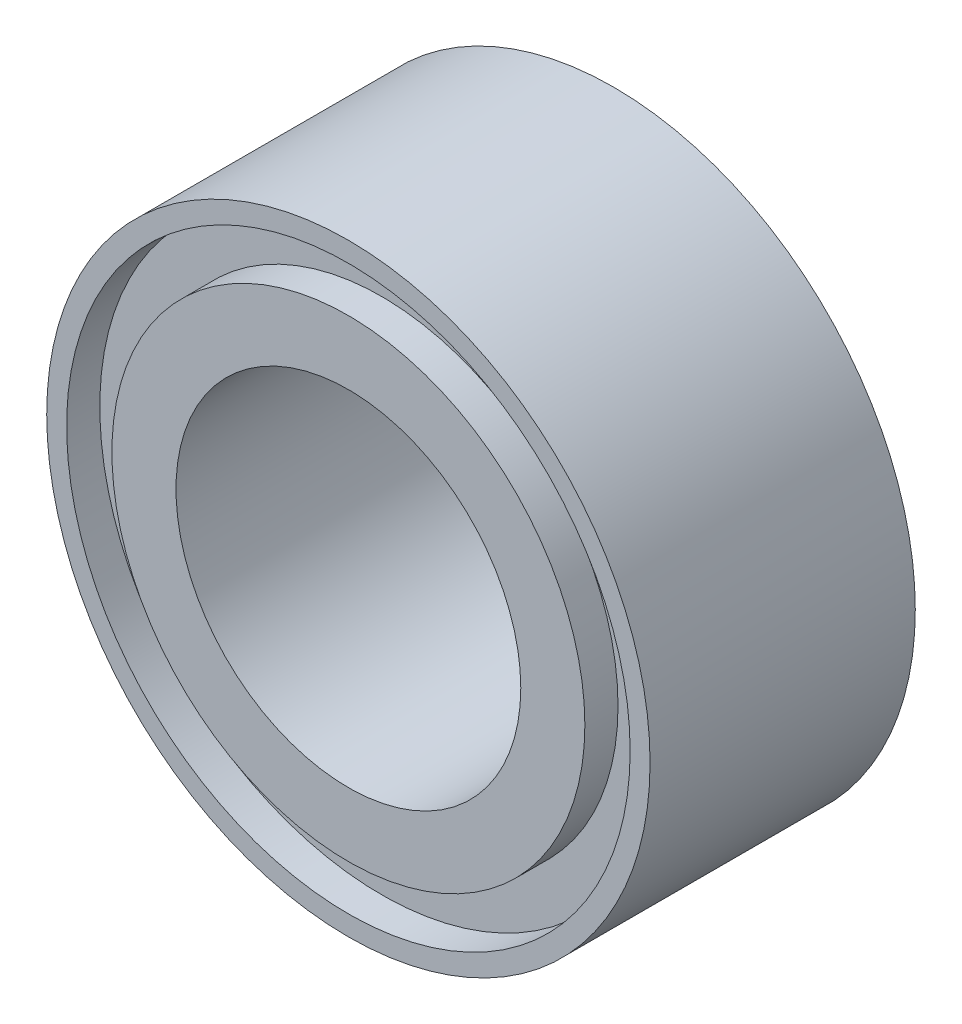
ISO-10303-21;
HEADER;
FILE_DESCRIPTION(('STEP AP214'),'2;1');
FILE_NAME('part.step','',(''),(''),'','','');
FILE_SCHEMA(('AUTOMOTIVE_DESIGN { 1 0 10303 214 1 1 1 1 }'));
ENDSEC;
DATA;
#1=APPLICATION_CONTEXT('core data for automotive mechanical design processes');
#2=APPLICATION_PROTOCOL_DEFINITION('international standard','automotive_design',2000,#1);
#3=PRODUCT_CONTEXT('',#1,'mechanical');
#4=PRODUCT('Part','Part','',(#3));
#5=PRODUCT_RELATED_PRODUCT_CATEGORY('part','',(#4));
#6=PRODUCT_DEFINITION_FORMATION('','',#4);
#7=PRODUCT_DEFINITION_CONTEXT('part definition',#1,'design');
#8=PRODUCT_DEFINITION('design','',#6,#7);
#9=PRODUCT_DEFINITION_SHAPE('','',#8);
#10=(LENGTH_UNIT() NAMED_UNIT(*) SI_UNIT(.MILLI.,.METRE.));
#11=(NAMED_UNIT(*) PLANE_ANGLE_UNIT() SI_UNIT($,.RADIAN.));
#12=(NAMED_UNIT(*) SI_UNIT($,.STERADIAN.) SOLID_ANGLE_UNIT());
#13=UNCERTAINTY_MEASURE_WITH_UNIT(LENGTH_MEASURE(1.E-05),#10,'distance_accuracy_value','');
#14=(GEOMETRIC_REPRESENTATION_CONTEXT(3) GLOBAL_UNCERTAINTY_ASSIGNED_CONTEXT((#13)) GLOBAL_UNIT_ASSIGNED_CONTEXT((#10,
#11,#12)) REPRESENTATION_CONTEXT('',''));
#15=CARTESIAN_POINT('',(0.,0.,0.));
#16=DIRECTION('',(0.,0.,1.));
#17=DIRECTION('',(1.,0.,0.));
#18=AXIS2_PLACEMENT_3D('',#15,#16,#17);
#19=CARTESIAN_POINT('',(0.,0.,-20.));
#20=DIRECTION('',(0.,0.,-1.));
#21=DIRECTION('',(1.,0.,0.));
#22=AXIS2_PLACEMENT_3D('',#19,#20,#21);
#23=PLANE('',#22);
#24=CARTESIAN_POINT('',(0.,0.,-20.));
#25=DIRECTION('',(0.,0.,1.));
#26=DIRECTION('',(1.,0.,0.));
#27=AXIS2_PLACEMENT_3D('',#24,#25,#26);
#28=CIRCLE('',#27,26.);
#29=CARTESIAN_POINT('',(26.,0.,-20.));
#30=VERTEX_POINT('',#29);
#31=EDGE_CURVE('E79',#30,#30,#28,.T.);
#32=ORIENTED_EDGE('',*,*,#31,.T.);
#33=EDGE_LOOP('',(#32));
#34=FACE_BOUND('',#33,.T.);
#35=CARTESIAN_POINT('',(0.,0.,-20.));
#36=DIRECTION('',(0.,0.,1.));
#37=DIRECTION('',(1.,0.,0.));
#38=AXIS2_PLACEMENT_3D('',#35,#36,#37);
#39=CIRCLE('',#38,35.6656453113803);
#40=CARTESIAN_POINT('',(35.6656453113803,0.,-20.));
#41=VERTEX_POINT('',#40);
#42=EDGE_CURVE('E89',#41,#41,#39,.T.);
#43=ORIENTED_EDGE('',*,*,#42,.F.);
#44=EDGE_LOOP('',(#43));
#45=FACE_BOUND('',#44,.T.);
#46=ADVANCED_FACE('F50',(#34,#45),#23,.T.);
#47=CARTESIAN_POINT('',(0.,0.,20.));
#48=DIRECTION('',(0.,0.,1.));
#49=DIRECTION('',(1.,0.,0.));
#50=AXIS2_PLACEMENT_3D('',#47,#48,#49);
#51=PLANE('',#50);
#52=CARTESIAN_POINT('',(0.,0.,20.));
#53=DIRECTION('',(0.,0.,1.));
#54=DIRECTION('',(1.,0.,0.));
#55=AXIS2_PLACEMENT_3D('',#52,#53,#54);
#56=CIRCLE('',#55,26.);
#57=CARTESIAN_POINT('',(26.,0.,20.));
#58=VERTEX_POINT('',#57);
#59=EDGE_CURVE('E57',#58,#58,#56,.T.);
#60=ORIENTED_EDGE('',*,*,#59,.F.);
#61=EDGE_LOOP('',(#60));
#62=FACE_BOUND('',#61,.T.);
#63=CARTESIAN_POINT('',(0.,0.,20.));
#64=DIRECTION('',(0.,0.,1.));
#65=DIRECTION('',(1.,0.,0.));
#66=AXIS2_PLACEMENT_3D('',#63,#64,#65);
#67=CIRCLE('',#66,35.6656453113803);
#68=CARTESIAN_POINT('',(35.6656453113803,0.,20.));
#69=VERTEX_POINT('',#68);
#70=EDGE_CURVE('E71',#69,#69,#67,.T.);
#71=ORIENTED_EDGE('',*,*,#70,.T.);
#72=EDGE_LOOP('',(#71));
#73=FACE_BOUND('',#72,.T.);
#74=ADVANCED_FACE('F106',(#62,#73),#51,.T.);
#75=CARTESIAN_POINT('',(0.,0.,20.));
#76=DIRECTION('',(0.,0.,1.));
#77=DIRECTION('',(1.,0.,0.));
#78=AXIS2_PLACEMENT_3D('',#75,#76,#77);
#79=CIRCLE('',#78,42.4935785650285);
#80=CARTESIAN_POINT('',(42.4935785650285,0.,20.));
#81=VERTEX_POINT('',#80);
#82=EDGE_CURVE('E65',#81,#81,#79,.T.);
#83=ORIENTED_EDGE('',*,*,#82,.F.);
#84=EDGE_LOOP('',(#83));
#85=FACE_BOUND('',#84,.T.);
#86=CARTESIAN_POINT('',(0.,0.,20.));
#87=DIRECTION('',(0.,0.,1.));
#88=DIRECTION('',(1.,0.,0.));
#89=AXIS2_PLACEMENT_3D('',#86,#87,#88);
#90=CIRCLE('',#89,45.5);
#91=CARTESIAN_POINT('',(45.5,0.,20.));
#92=VERTEX_POINT('',#91);
#93=EDGE_CURVE('E11',#92,#92,#90,.T.);
#94=ORIENTED_EDGE('',*,*,#93,.T.);
#95=EDGE_LOOP('',(#94));
#96=FACE_BOUND('',#95,.T.);
#97=ADVANCED_FACE('F113',(#85,#96),#51,.T.);
#98=CARTESIAN_POINT('',(0.,0.,20.));
#99=DIRECTION('',(0.,0.,-1.));
#100=DIRECTION('',(-1.,0.,0.));
#101=AXIS2_PLACEMENT_3D('',#98,#99,#100);
#102=CYLINDRICAL_SURFACE('',#101,45.5);
#103=ORIENTED_EDGE('',*,*,#93,.F.);
#104=EDGE_LOOP('',(#103));
#105=FACE_BOUND('',#104,.T.);
#106=CARTESIAN_POINT('',(0.,0.,-20.));
#107=DIRECTION('',(0.,0.,1.));
#108=DIRECTION('',(1.,0.,0.));
#109=AXIS2_PLACEMENT_3D('',#106,#107,#108);
#110=CIRCLE('',#109,45.5);
#111=CARTESIAN_POINT('',(45.5,0.,-20.));
#112=VERTEX_POINT('',#111);
#113=EDGE_CURVE('E74',#112,#112,#110,.T.);
#114=ORIENTED_EDGE('',*,*,#113,.T.);
#115=EDGE_LOOP('',(#114));
#116=FACE_BOUND('',#115,.T.);
#117=ADVANCED_FACE('F52',(#105,#116),#102,.T.);
#118=CARTESIAN_POINT('',(0.,0.,20.));
#119=DIRECTION('',(0.,0.,-1.));
#120=DIRECTION('',(-1.,0.,0.));
#121=AXIS2_PLACEMENT_3D('',#118,#119,#120);
#122=CYLINDRICAL_SURFACE('',#121,26.);
#123=ORIENTED_EDGE('',*,*,#59,.T.);
#124=EDGE_LOOP('',(#123));
#125=FACE_BOUND('',#124,.T.);
#126=ORIENTED_EDGE('',*,*,#31,.F.);
#127=EDGE_LOOP('',(#126));
#128=FACE_BOUND('',#127,.T.);
#129=ADVANCED_FACE('F133',(#125,#128),#122,.F.);
#130=CARTESIAN_POINT('',(0.,0.,15.));
#131=DIRECTION('',(0.,0.,1.));
#132=DIRECTION('',(1.,0.,0.));
#133=AXIS2_PLACEMENT_3D('',#130,#131,#132);
#134=CYLINDRICAL_SURFACE('',#133,42.4935785650285);
#135=CARTESIAN_POINT('',(0.,0.,15.));
#136=DIRECTION('',(0.,0.,1.));
#137=DIRECTION('',(1.,0.,0.));
#138=AXIS2_PLACEMENT_3D('',#135,#136,#137);
#139=CIRCLE('',#138,42.4935785650285);
#140=CARTESIAN_POINT('',(42.4935785650285,0.,15.));
#141=VERTEX_POINT('',#140);
#142=EDGE_CURVE('E61',#141,#141,#139,.T.);
#143=ORIENTED_EDGE('',*,*,#142,.F.);
#144=EDGE_LOOP('',(#143));
#145=FACE_BOUND('',#144,.T.);
#146=ORIENTED_EDGE('',*,*,#82,.T.);
#147=EDGE_LOOP('',(#146));
#148=FACE_BOUND('',#147,.T.);
#149=ADVANCED_FACE('F139',(#145,#148),#134,.F.);
#150=CARTESIAN_POINT('',(0.,0.,15.));
#151=DIRECTION('',(0.,0.,1.));
#152=DIRECTION('',(1.,0.,0.));
#153=AXIS2_PLACEMENT_3D('',#150,#151,#152);
#154=PLANE('',#153);
#155=CARTESIAN_POINT('',(0.,0.,15.));
#156=DIRECTION('',(0.,0.,1.));
#157=DIRECTION('',(1.,0.,0.));
#158=AXIS2_PLACEMENT_3D('',#155,#156,#157);
#159=CIRCLE('',#158,35.6656453113803);
#160=CARTESIAN_POINT('',(35.6656453113803,0.,15.));
#161=VERTEX_POINT('',#160);
#162=EDGE_CURVE('E69',#161,#161,#159,.T.);
#163=ORIENTED_EDGE('',*,*,#162,.F.);
#164=EDGE_LOOP('',(#163));
#165=FACE_BOUND('',#164,.T.);
#166=ORIENTED_EDGE('',*,*,#142,.T.);
#167=EDGE_LOOP('',(#166));
#168=FACE_BOUND('',#167,.T.);
#169=ADVANCED_FACE('F126',(#165,#168),#154,.T.);
#170=CARTESIAN_POINT('',(0.,0.,15.));
#171=DIRECTION('',(0.,0.,1.));
#172=DIRECTION('',(1.,0.,0.));
#173=AXIS2_PLACEMENT_3D('',#170,#171,#172);
#174=CYLINDRICAL_SURFACE('',#173,35.6656453113803);
#175=ORIENTED_EDGE('',*,*,#162,.T.);
#176=EDGE_LOOP('',(#175));
#177=FACE_BOUND('',#176,.T.);
#178=ORIENTED_EDGE('',*,*,#70,.F.);
#179=EDGE_LOOP('',(#178));
#180=FACE_BOUND('',#179,.T.);
#181=ADVANCED_FACE('F118',(#177,#180),#174,.T.);
#182=CARTESIAN_POINT('',(0.,0.,-20.));
#183=DIRECTION('',(0.,0.,1.));
#184=DIRECTION('',(1.,0.,0.));
#185=AXIS2_PLACEMENT_3D('',#182,#183,#184);
#186=CIRCLE('',#185,42.4935785650285);
#187=CARTESIAN_POINT('',(42.4935785650285,0.,-20.));
#188=VERTEX_POINT('',#187);
#189=EDGE_CURVE('E83',#188,#188,#186,.T.);
#190=ORIENTED_EDGE('',*,*,#189,.T.);
#191=EDGE_LOOP('',(#190));
#192=FACE_BOUND('',#191,.T.);
#193=ORIENTED_EDGE('',*,*,#113,.F.);
#194=EDGE_LOOP('',(#193));
#195=FACE_BOUND('',#194,.T.);
#196=ADVANCED_FACE('F109',(#192,#195),#23,.T.);
#197=CARTESIAN_POINT('',(0.,0.,-15.));
#198=DIRECTION('',(0.,0.,-1.));
#199=DIRECTION('',(1.,0.,0.));
#200=AXIS2_PLACEMENT_3D('',#197,#198,#199);
#201=PLANE('',#200);
#202=CARTESIAN_POINT('',(0.,0.,-15.));
#203=DIRECTION('',(0.,0.,1.));
#204=DIRECTION('',(1.,0.,0.));
#205=AXIS2_PLACEMENT_3D('',#202,#203,#204);
#206=CIRCLE('',#205,42.4935785650285);
#207=CARTESIAN_POINT('',(42.4935785650285,0.,-15.));
#208=VERTEX_POINT('',#207);
#209=EDGE_CURVE('E82',#208,#208,#206,.T.);
#210=ORIENTED_EDGE('',*,*,#209,.F.);
#211=EDGE_LOOP('',(#210));
#212=FACE_BOUND('',#211,.T.);
#213=CARTESIAN_POINT('',(0.,0.,-15.));
#214=DIRECTION('',(0.,0.,1.));
#215=DIRECTION('',(1.,0.,0.));
#216=AXIS2_PLACEMENT_3D('',#213,#214,#215);
#217=CIRCLE('',#216,35.6656453113803);
#218=CARTESIAN_POINT('',(35.6656453113803,0.,-15.));
#219=VERTEX_POINT('',#218);
#220=EDGE_CURVE('E86',#219,#219,#217,.T.);
#221=ORIENTED_EDGE('',*,*,#220,.T.);
#222=EDGE_LOOP('',(#221));
#223=FACE_BOUND('',#222,.T.);
#224=ADVANCED_FACE('F96',(#212,#223),#201,.T.);
#225=CARTESIAN_POINT('',(0.,0.,-15.));
#226=DIRECTION('',(0.,0.,-1.));
#227=DIRECTION('',(-1.,0.,0.));
#228=AXIS2_PLACEMENT_3D('',#225,#226,#227);
#229=CYLINDRICAL_SURFACE('',#228,42.4935785650285);
#230=ORIENTED_EDGE('',*,*,#209,.T.);
#231=EDGE_LOOP('',(#230));
#232=FACE_BOUND('',#231,.T.);
#233=ORIENTED_EDGE('',*,*,#189,.F.);
#234=EDGE_LOOP('',(#233));
#235=FACE_BOUND('',#234,.T.);
#236=ADVANCED_FACE('F101',(#232,#235),#229,.F.);
#237=CARTESIAN_POINT('',(0.,0.,-15.));
#238=DIRECTION('',(0.,0.,-1.));
#239=DIRECTION('',(-1.,0.,0.));
#240=AXIS2_PLACEMENT_3D('',#237,#238,#239);
#241=CYLINDRICAL_SURFACE('',#240,35.6656453113803);
#242=ORIENTED_EDGE('',*,*,#220,.F.);
#243=EDGE_LOOP('',(#242));
#244=FACE_BOUND('',#243,.T.);
#245=ORIENTED_EDGE('',*,*,#42,.T.);
#246=EDGE_LOOP('',(#245));
#247=FACE_BOUND('',#246,.T.);
#248=ADVANCED_FACE('F98',(#244,#247),#241,.T.);
#249=CLOSED_SHELL('',(#46,#74,#97,#117,#129,#149,#169,#181,#196,#224,#236,#248));
#250=MANIFOLD_SOLID_BREP('B2',#249);
#251=ADVANCED_BREP_SHAPE_REPRESENTATION('',(#18,#250),#14);
#252=SHAPE_DEFINITION_REPRESENTATION(#9,#251);
ENDSEC;
END-ISO-10303-21;
